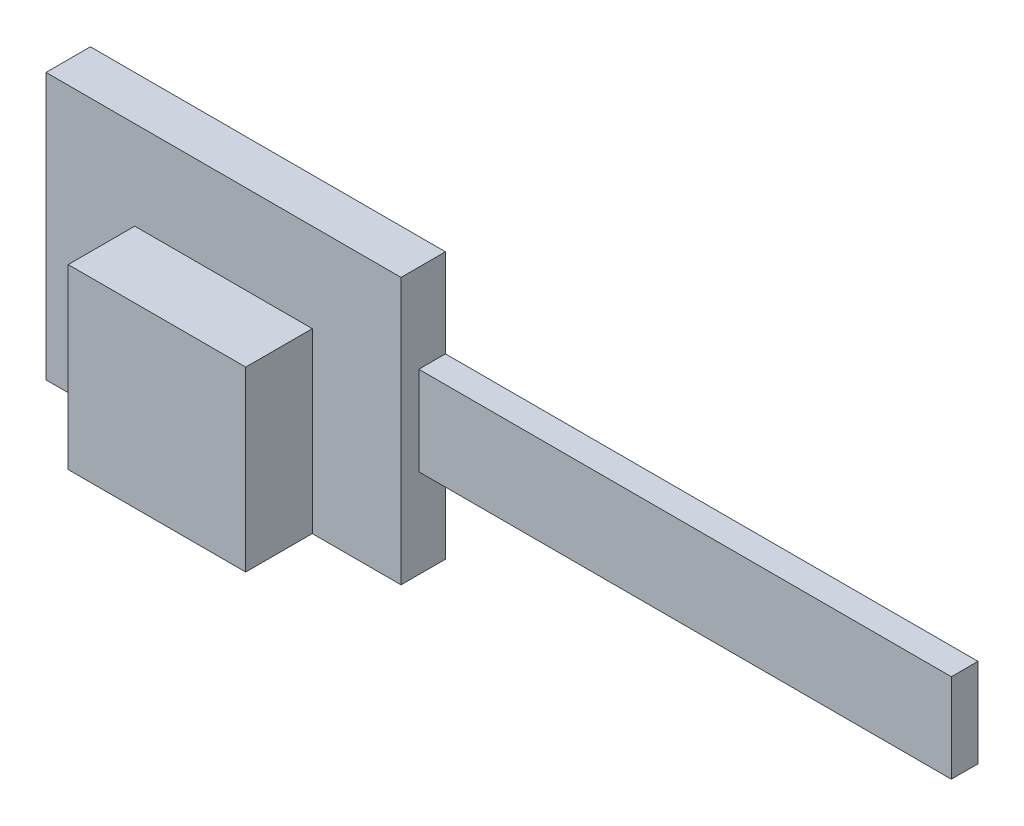
ISO-10303-21;
HEADER;
FILE_DESCRIPTION(('STEP AP214'),'2;1');
FILE_NAME('part.step','',(''),(''),'','','');
FILE_SCHEMA(('AUTOMOTIVE_DESIGN { 1 0 10303 214 1 1 1 1 }'));
ENDSEC;
DATA;
#1=APPLICATION_CONTEXT('core data for automotive mechanical design processes');
#2=APPLICATION_PROTOCOL_DEFINITION('international standard','automotive_design',2000,#1);
#3=PRODUCT_CONTEXT('',#1,'mechanical');
#4=PRODUCT('Part','Part','',(#3));
#5=PRODUCT_RELATED_PRODUCT_CATEGORY('part','',(#4));
#6=PRODUCT_DEFINITION_FORMATION('','',#4);
#7=PRODUCT_DEFINITION_CONTEXT('part definition',#1,'design');
#8=PRODUCT_DEFINITION('design','',#6,#7);
#9=PRODUCT_DEFINITION_SHAPE('','',#8);
#10=(LENGTH_UNIT() NAMED_UNIT(*) SI_UNIT(.MILLI.,.METRE.));
#11=(NAMED_UNIT(*) PLANE_ANGLE_UNIT() SI_UNIT($,.RADIAN.));
#12=(NAMED_UNIT(*) SI_UNIT($,.STERADIAN.) SOLID_ANGLE_UNIT());
#13=UNCERTAINTY_MEASURE_WITH_UNIT(LENGTH_MEASURE(1.E-05),#10,'distance_accuracy_value','');
#14=(GEOMETRIC_REPRESENTATION_CONTEXT(3) GLOBAL_UNCERTAINTY_ASSIGNED_CONTEXT((#13)) GLOBAL_UNIT_ASSIGNED_CONTEXT((#10,
#11,#12)) REPRESENTATION_CONTEXT('',''));
#15=CARTESIAN_POINT('',(0.,0.,0.));
#16=DIRECTION('',(0.,0.,1.));
#17=DIRECTION('',(1.,0.,0.));
#18=AXIS2_PLACEMENT_3D('',#15,#16,#17);
#19=CARTESIAN_POINT('',(4.,1.00757199680967,0.6));
#20=DIRECTION('',(-1.,0.,0.));
#21=DIRECTION('',(0.,0.,1.));
#22=AXIS2_PLACEMENT_3D('',#19,#20,#21);
#23=PLANE('',#22);
#24=DIRECTION('',(0.,1.,0.));
#25=VECTOR('',#24,1.);
#26=CARTESIAN_POINT('',(4.,1.00757199680967,0.));
#27=LINE('',#26,#25);
#28=CARTESIAN_POINT('',(4.,-0.992428003190327,0.));
#29=VERTEX_POINT('',#28);
#30=CARTESIAN_POINT('',(4.,1.00757199680967,0.));
#31=VERTEX_POINT('',#30);
#32=EDGE_CURVE('E111',#29,#31,#27,.T.);
#33=ORIENTED_EDGE('',*,*,#32,.F.);
#34=DIRECTION('',(0.,0.,-1.));
#35=VECTOR('',#34,1.);
#36=CARTESIAN_POINT('',(4.,-0.992428003190327,0.6));
#37=LINE('',#36,#35);
#38=CARTESIAN_POINT('',(4.,-0.992428003190327,0.6));
#39=VERTEX_POINT('',#38);
#40=EDGE_CURVE('E12',#39,#29,#37,.T.);
#41=ORIENTED_EDGE('',*,*,#40,.F.);
#42=DIRECTION('',(0.,1.,0.));
#43=VECTOR('',#42,1.);
#44=CARTESIAN_POINT('',(4.,1.00757199680967,0.6));
#45=LINE('',#44,#43);
#46=CARTESIAN_POINT('',(4.,1.00757199680967,0.6));
#47=VERTEX_POINT('',#46);
#48=EDGE_CURVE('E105',#39,#47,#45,.T.);
#49=ORIENTED_EDGE('',*,*,#48,.T.);
#50=DIRECTION('',(0.,0.,-1.));
#51=VECTOR('',#50,1.);
#52=CARTESIAN_POINT('',(4.,1.00757199680967,0.6));
#53=LINE('',#52,#51);
#54=EDGE_CURVE('E50',#47,#31,#53,.T.);
#55=ORIENTED_EDGE('',*,*,#54,.T.);
#56=EDGE_LOOP('',(#33,#41,#49,#55));
#57=FACE_BOUND('',#56,.T.);
#58=ADVANCED_FACE('F47',(#57),#23,.T.);
#59=CARTESIAN_POINT('',(4.,-0.992428003190327,0.6));
#60=DIRECTION('',(0.,-1.,0.));
#61=DIRECTION('',(1.,0.,0.));
#62=AXIS2_PLACEMENT_3D('',#59,#60,#61);
#63=PLANE('',#62);
#64=DIRECTION('',(-1.,0.,0.));
#65=VECTOR('',#64,1.);
#66=CARTESIAN_POINT('',(4.,-0.992428003190327,0.));
#67=LINE('',#66,#65);
#68=CARTESIAN_POINT('',(16.,-0.992428003190328,0.));
#69=VERTEX_POINT('',#68);
#70=EDGE_CURVE('E107',#69,#29,#67,.T.);
#71=ORIENTED_EDGE('',*,*,#70,.F.);
#72=DIRECTION('',(0.,0.,-1.));
#73=VECTOR('',#72,1.);
#74=CARTESIAN_POINT('',(16.,-0.992428003190328,0.6));
#75=LINE('',#74,#73);
#76=CARTESIAN_POINT('',(16.,-0.992428003190328,0.6));
#77=VERTEX_POINT('',#76);
#78=EDGE_CURVE('E56',#77,#69,#75,.T.);
#79=ORIENTED_EDGE('',*,*,#78,.F.);
#80=DIRECTION('',(-1.,0.,0.));
#81=VECTOR('',#80,1.);
#82=CARTESIAN_POINT('',(4.,-0.992428003190327,0.6));
#83=LINE('',#82,#81);
#84=EDGE_CURVE('E102',#77,#39,#83,.T.);
#85=ORIENTED_EDGE('',*,*,#84,.T.);
#86=ORIENTED_EDGE('',*,*,#40,.T.);
#87=EDGE_LOOP('',(#71,#79,#85,#86));
#88=FACE_BOUND('',#87,.T.);
#89=ADVANCED_FACE('F121',(#88),#63,.T.);
#90=CARTESIAN_POINT('',(16.,1.00757199680967,0.6));
#91=DIRECTION('',(1.,0.,0.));
#92=DIRECTION('',(0.,0.,-1.));
#93=AXIS2_PLACEMENT_3D('',#90,#91,#92);
#94=PLANE('',#93);
#95=DIRECTION('',(0.,-1.,0.));
#96=VECTOR('',#95,1.);
#97=CARTESIAN_POINT('',(16.,1.00757199680967,0.));
#98=LINE('',#97,#96);
#99=CARTESIAN_POINT('',(16.,1.00757199680967,0.));
#100=VERTEX_POINT('',#99);
#101=EDGE_CURVE('E97',#100,#69,#98,.T.);
#102=ORIENTED_EDGE('',*,*,#101,.F.);
#103=DIRECTION('',(0.,0.,-1.));
#104=VECTOR('',#103,1.);
#105=CARTESIAN_POINT('',(16.,1.00757199680967,0.6));
#106=LINE('',#105,#104);
#107=CARTESIAN_POINT('',(16.,1.00757199680967,0.6));
#108=VERTEX_POINT('',#107);
#109=EDGE_CURVE('E92',#108,#100,#106,.T.);
#110=ORIENTED_EDGE('',*,*,#109,.F.);
#111=DIRECTION('',(0.,-1.,0.));
#112=VECTOR('',#111,1.);
#113=CARTESIAN_POINT('',(16.,1.00757199680967,0.6));
#114=LINE('',#113,#112);
#115=EDGE_CURVE('E95',#108,#77,#114,.T.);
#116=ORIENTED_EDGE('',*,*,#115,.T.);
#117=ORIENTED_EDGE('',*,*,#78,.T.);
#118=EDGE_LOOP('',(#102,#110,#116,#117));
#119=FACE_BOUND('',#118,.T.);
#120=ADVANCED_FACE('F94',(#119),#94,.T.);
#121=CARTESIAN_POINT('',(4.,1.00757199680967,0.6));
#122=DIRECTION('',(0.,1.,0.));
#123=DIRECTION('',(-1.,0.,0.));
#124=AXIS2_PLACEMENT_3D('',#121,#122,#123);
#125=PLANE('',#124);
#126=DIRECTION('',(1.,0.,0.));
#127=VECTOR('',#126,1.);
#128=CARTESIAN_POINT('',(4.,1.00757199680967,0.));
#129=LINE('',#128,#127);
#130=EDGE_CURVE('E114',#31,#100,#129,.T.);
#131=ORIENTED_EDGE('',*,*,#130,.F.);
#132=ORIENTED_EDGE('',*,*,#54,.F.);
#133=DIRECTION('',(1.,0.,0.));
#134=VECTOR('',#133,1.);
#135=CARTESIAN_POINT('',(4.,1.00757199680967,0.6));
#136=LINE('',#135,#134);
#137=EDGE_CURVE('E101',#47,#108,#136,.T.);
#138=ORIENTED_EDGE('',*,*,#137,.T.);
#139=ORIENTED_EDGE('',*,*,#109,.T.);
#140=EDGE_LOOP('',(#131,#132,#138,#139));
#141=FACE_BOUND('',#140,.T.);
#142=ADVANCED_FACE('F104',(#141),#125,.T.);
#143=CARTESIAN_POINT('',(0.,0.,0.6));
#144=DIRECTION('',(0.,0.,1.));
#145=DIRECTION('',(1.,0.,0.));
#146=AXIS2_PLACEMENT_3D('',#143,#144,#145);
#147=PLANE('',#146);
#148=ORIENTED_EDGE('',*,*,#48,.F.);
#149=ORIENTED_EDGE('',*,*,#84,.F.);
#150=ORIENTED_EDGE('',*,*,#115,.F.);
#151=ORIENTED_EDGE('',*,*,#137,.F.);
#152=EDGE_LOOP('',(#148,#149,#150,#151));
#153=FACE_BOUND('',#152,.T.);
#154=ADVANCED_FACE('F100',(#153),#147,.T.);
#155=CARTESIAN_POINT('',(0.,0.,0.));
#156=DIRECTION('',(0.,0.,1.));
#157=DIRECTION('',(1.,0.,0.));
#158=AXIS2_PLACEMENT_3D('',#155,#156,#157);
#159=PLANE('',#158);
#160=ORIENTED_EDGE('',*,*,#32,.T.);
#161=ORIENTED_EDGE('',*,*,#130,.T.);
#162=ORIENTED_EDGE('',*,*,#101,.T.);
#163=ORIENTED_EDGE('',*,*,#70,.T.);
#164=EDGE_LOOP('',(#160,#161,#162,#163));
#165=FACE_BOUND('',#164,.T.);
#166=ADVANCED_FACE('F120',(#165),#159,.F.);
#167=CLOSED_SHELL('',(#58,#89,#120,#142,#154,#166));
#168=MANIFOLD_SOLID_BREP('B2',#167);
#169=CARTESIAN_POINT('',(-4.,3.,1.));
#170=DIRECTION('',(1.,0.,0.));
#171=DIRECTION('',(0.,0.,-1.));
#172=AXIS2_PLACEMENT_3D('',#169,#170,#171);
#173=PLANE('',#172);
#174=DIRECTION('',(0.,-1.,0.));
#175=VECTOR('',#174,1.);
#176=CARTESIAN_POINT('',(-4.,3.,0.));
#177=LINE('',#176,#175);
#178=CARTESIAN_POINT('',(-4.,3.,0.));
#179=VERTEX_POINT('',#178);
#180=CARTESIAN_POINT('',(-4.,-3.,0.));
#181=VERTEX_POINT('',#180);
#182=EDGE_CURVE('E255',#179,#181,#177,.T.);
#183=ORIENTED_EDGE('',*,*,#182,.T.);
#184=DIRECTION('',(0.,0.,-1.));
#185=VECTOR('',#184,1.);
#186=CARTESIAN_POINT('',(-4.,-3.,1.));
#187=LINE('',#186,#185);
#188=CARTESIAN_POINT('',(-4.,-3.,1.));
#189=VERTEX_POINT('',#188);
#190=EDGE_CURVE('E45',#189,#181,#187,.T.);
#191=ORIENTED_EDGE('',*,*,#190,.F.);
#192=DIRECTION('',(0.,-1.,0.));
#193=VECTOR('',#192,1.);
#194=CARTESIAN_POINT('',(-4.,3.,1.));
#195=LINE('',#194,#193);
#196=CARTESIAN_POINT('',(-4.,3.,1.));
#197=VERTEX_POINT('',#196);
#198=EDGE_CURVE('E264',#197,#189,#195,.T.);
#199=ORIENTED_EDGE('',*,*,#198,.F.);
#200=DIRECTION('',(0.,0.,-1.));
#201=VECTOR('',#200,1.);
#202=CARTESIAN_POINT('',(-4.,3.,1.));
#203=LINE('',#202,#201);
#204=EDGE_CURVE('E274',#197,#179,#203,.T.);
#205=ORIENTED_EDGE('',*,*,#204,.T.);
#206=EDGE_LOOP('',(#183,#191,#199,#205));
#207=FACE_BOUND('',#206,.T.);
#208=ADVANCED_FACE('F170',(#207),#173,.F.);
#209=CARTESIAN_POINT('',(-4.,-3.,1.));
#210=DIRECTION('',(0.,1.,0.));
#211=DIRECTION('',(-1.,0.,0.));
#212=AXIS2_PLACEMENT_3D('',#209,#210,#211);
#213=PLANE('',#212);
#214=DIRECTION('',(1.,0.,0.));
#215=VECTOR('',#214,1.);
#216=CARTESIAN_POINT('',(-4.,-3.,0.));
#217=LINE('',#216,#215);
#218=CARTESIAN_POINT('',(4.,-3.,0.));
#219=VERTEX_POINT('',#218);
#220=EDGE_CURVE('E258',#181,#219,#217,.T.);
#221=ORIENTED_EDGE('',*,*,#220,.T.);
#222=DIRECTION('',(0.,0.,-1.));
#223=VECTOR('',#222,1.);
#224=CARTESIAN_POINT('',(4.,-3.,1.));
#225=LINE('',#224,#223);
#226=CARTESIAN_POINT('',(4.,-3.,1.));
#227=VERTEX_POINT('',#226);
#228=EDGE_CURVE('E177',#227,#219,#225,.T.);
#229=ORIENTED_EDGE('',*,*,#228,.F.);
#230=DIRECTION('',(1.,0.,0.));
#231=VECTOR('',#230,1.);
#232=CARTESIAN_POINT('',(-4.,-3.,1.));
#233=LINE('',#232,#231);
#234=CARTESIAN_POINT('',(2.,-3.,1.));
#235=VERTEX_POINT('',#234);
#236=EDGE_CURVE('E267',#235,#227,#233,.T.);
#237=ORIENTED_EDGE('',*,*,#236,.F.);
#238=DIRECTION('',(0.,0.,-1.));
#239=VECTOR('',#238,1.);
#240=CARTESIAN_POINT('',(2.,-3.,2.5));
#241=LINE('',#240,#239);
#242=CARTESIAN_POINT('',(2.,-3.,2.5));
#243=VERTEX_POINT('',#242);
#244=EDGE_CURVE('E239',#243,#235,#241,.T.);
#245=ORIENTED_EDGE('',*,*,#244,.F.);
#246=DIRECTION('',(1.,0.,0.));
#247=VECTOR('',#246,1.);
#248=CARTESIAN_POINT('',(-2.,-3.,2.5));
#249=LINE('',#248,#247);
#250=CARTESIAN_POINT('',(-2.,-3.,2.5));
#251=VERTEX_POINT('',#250);
#252=EDGE_CURVE('E233',#251,#243,#249,.T.);
#253=ORIENTED_EDGE('',*,*,#252,.F.);
#254=DIRECTION('',(0.,0.,-1.));
#255=VECTOR('',#254,1.);
#256=CARTESIAN_POINT('',(-2.,-3.,2.5));
#257=LINE('',#256,#255);
#258=CARTESIAN_POINT('',(-2.,-3.,1.));
#259=VERTEX_POINT('',#258);
#260=EDGE_CURVE('E237',#251,#259,#257,.T.);
#261=ORIENTED_EDGE('',*,*,#260,.T.);
#262=EDGE_CURVE('E269',#189,#259,#233,.T.);
#263=ORIENTED_EDGE('',*,*,#262,.F.);
#264=ORIENTED_EDGE('',*,*,#190,.T.);
#265=EDGE_LOOP('',(#221,#229,#237,#245,#253,#261,#263,#264));
#266=FACE_BOUND('',#265,.T.);
#267=ADVANCED_FACE('F235',(#266),#213,.F.);
#268=CARTESIAN_POINT('',(4.,3.,1.));
#269=DIRECTION('',(-1.,0.,0.));
#270=DIRECTION('',(0.,0.,1.));
#271=AXIS2_PLACEMENT_3D('',#268,#269,#270);
#272=PLANE('',#271);
#273=DIRECTION('',(0.,1.,0.));
#274=VECTOR('',#273,1.);
#275=CARTESIAN_POINT('',(4.,3.,0.));
#276=LINE('',#275,#274);
#277=CARTESIAN_POINT('',(4.,3.,0.));
#278=VERTEX_POINT('',#277);
#279=EDGE_CURVE('E277',#219,#278,#276,.T.);
#280=ORIENTED_EDGE('',*,*,#279,.T.);
#281=DIRECTION('',(0.,0.,-1.));
#282=VECTOR('',#281,1.);
#283=CARTESIAN_POINT('',(4.,3.,1.));
#284=LINE('',#283,#282);
#285=CARTESIAN_POINT('',(4.,3.,1.));
#286=VERTEX_POINT('',#285);
#287=EDGE_CURVE('E282',#286,#278,#284,.T.);
#288=ORIENTED_EDGE('',*,*,#287,.F.);
#289=DIRECTION('',(0.,1.,0.));
#290=VECTOR('',#289,1.);
#291=CARTESIAN_POINT('',(4.,3.,1.));
#292=LINE('',#291,#290);
#293=EDGE_CURVE('E271',#227,#286,#292,.T.);
#294=ORIENTED_EDGE('',*,*,#293,.F.);
#295=ORIENTED_EDGE('',*,*,#228,.T.);
#296=EDGE_LOOP('',(#280,#288,#294,#295));
#297=FACE_BOUND('',#296,.T.);
#298=ADVANCED_FACE('F289',(#297),#272,.F.);
#299=CARTESIAN_POINT('',(-4.,3.,1.));
#300=DIRECTION('',(0.,-1.,0.));
#301=DIRECTION('',(1.,0.,0.));
#302=AXIS2_PLACEMENT_3D('',#299,#300,#301);
#303=PLANE('',#302);
#304=DIRECTION('',(-1.,0.,0.));
#305=VECTOR('',#304,1.);
#306=CARTESIAN_POINT('',(-4.,3.,0.));
#307=LINE('',#306,#305);
#308=EDGE_CURVE('E268',#278,#179,#307,.T.);
#309=ORIENTED_EDGE('',*,*,#308,.T.);
#310=ORIENTED_EDGE('',*,*,#204,.F.);
#311=DIRECTION('',(-1.,0.,0.));
#312=VECTOR('',#311,1.);
#313=CARTESIAN_POINT('',(-4.,3.,1.));
#314=LINE('',#313,#312);
#315=EDGE_CURVE('E273',#286,#197,#314,.T.);
#316=ORIENTED_EDGE('',*,*,#315,.F.);
#317=ORIENTED_EDGE('',*,*,#287,.T.);
#318=EDGE_LOOP('',(#309,#310,#316,#317));
#319=FACE_BOUND('',#318,.T.);
#320=ADVANCED_FACE('F297',(#319),#303,.F.);
#321=CARTESIAN_POINT('',(0.,0.,1.));
#322=DIRECTION('',(0.,0.,1.));
#323=DIRECTION('',(1.,0.,0.));
#324=AXIS2_PLACEMENT_3D('',#321,#322,#323);
#325=PLANE('',#324);
#326=DIRECTION('',(0.,-1.,0.));
#327=VECTOR('',#326,1.);
#328=CARTESIAN_POINT('',(-2.,1.,1.));
#329=LINE('',#328,#327);
#330=CARTESIAN_POINT('',(-2.,1.,1.));
#331=VERTEX_POINT('',#330);
#332=EDGE_CURVE('E184',#331,#259,#329,.T.);
#333=ORIENTED_EDGE('',*,*,#332,.F.);
#334=DIRECTION('',(-1.,0.,0.));
#335=VECTOR('',#334,1.);
#336=CARTESIAN_POINT('',(-2.,1.,1.));
#337=LINE('',#336,#335);
#338=CARTESIAN_POINT('',(2.,0.999999999999999,1.));
#339=VERTEX_POINT('',#338);
#340=EDGE_CURVE('E252',#339,#331,#337,.T.);
#341=ORIENTED_EDGE('',*,*,#340,.F.);
#342=DIRECTION('',(0.,1.,0.));
#343=VECTOR('',#342,1.);
#344=CARTESIAN_POINT('',(2.,0.999999999999999,1.));
#345=LINE('',#344,#343);
#346=EDGE_CURVE('E190',#235,#339,#345,.T.);
#347=ORIENTED_EDGE('',*,*,#346,.F.);
#348=ORIENTED_EDGE('',*,*,#236,.T.);
#349=ORIENTED_EDGE('',*,*,#293,.T.);
#350=ORIENTED_EDGE('',*,*,#315,.T.);
#351=ORIENTED_EDGE('',*,*,#198,.T.);
#352=ORIENTED_EDGE('',*,*,#262,.T.);
#353=EDGE_LOOP('',(#333,#341,#347,#348,#349,#350,#351,#352));
#354=FACE_BOUND('',#353,.T.);
#355=ADVANCED_FACE('F302',(#354),#325,.T.);
#356=CARTESIAN_POINT('',(0.,0.,0.));
#357=DIRECTION('',(0.,0.,1.));
#358=DIRECTION('',(1.,0.,0.));
#359=AXIS2_PLACEMENT_3D('',#356,#357,#358);
#360=PLANE('',#359);
#361=ORIENTED_EDGE('',*,*,#182,.F.);
#362=ORIENTED_EDGE('',*,*,#308,.F.);
#363=ORIENTED_EDGE('',*,*,#279,.F.);
#364=ORIENTED_EDGE('',*,*,#220,.F.);
#365=EDGE_LOOP('',(#361,#362,#363,#364));
#366=FACE_BOUND('',#365,.T.);
#367=ADVANCED_FACE('F294',(#366),#360,.F.);
#368=CARTESIAN_POINT('',(-2.,1.,2.5));
#369=DIRECTION('',(1.,0.,0.));
#370=DIRECTION('',(0.,1.,0.));
#371=AXIS2_PLACEMENT_3D('',#368,#369,#370);
#372=PLANE('',#371);
#373=ORIENTED_EDGE('',*,*,#332,.T.);
#374=ORIENTED_EDGE('',*,*,#260,.F.);
#375=DIRECTION('',(0.,-1.,0.));
#376=VECTOR('',#375,1.);
#377=CARTESIAN_POINT('',(-2.,1.,2.5));
#378=LINE('',#377,#376);
#379=CARTESIAN_POINT('',(-2.,1.,2.5));
#380=VERTEX_POINT('',#379);
#381=EDGE_CURVE('E243',#380,#251,#378,.T.);
#382=ORIENTED_EDGE('',*,*,#381,.F.);
#383=DIRECTION('',(0.,0.,-1.));
#384=VECTOR('',#383,1.);
#385=CARTESIAN_POINT('',(-2.,1.,2.5));
#386=LINE('',#385,#384);
#387=EDGE_CURVE('E308',#380,#331,#386,.T.);
#388=ORIENTED_EDGE('',*,*,#387,.T.);
#389=EDGE_LOOP('',(#373,#374,#382,#388));
#390=FACE_BOUND('',#389,.T.);
#391=ADVANCED_FACE('F254',(#390),#372,.F.);
#392=CARTESIAN_POINT('',(2.,0.999999999999999,2.5));
#393=DIRECTION('',(-1.,0.,0.));
#394=DIRECTION('',(0.,-1.,0.));
#395=AXIS2_PLACEMENT_3D('',#392,#393,#394);
#396=PLANE('',#395);
#397=ORIENTED_EDGE('',*,*,#346,.T.);
#398=DIRECTION('',(0.,0.,-1.));
#399=VECTOR('',#398,1.);
#400=CARTESIAN_POINT('',(2.,0.999999999999999,2.5));
#401=LINE('',#400,#399);
#402=CARTESIAN_POINT('',(2.,0.999999999999999,2.5));
#403=VERTEX_POINT('',#402);
#404=EDGE_CURVE('E260',#403,#339,#401,.T.);
#405=ORIENTED_EDGE('',*,*,#404,.F.);
#406=DIRECTION('',(0.,1.,0.));
#407=VECTOR('',#406,1.);
#408=CARTESIAN_POINT('',(2.,0.999999999999999,2.5));
#409=LINE('',#408,#407);
#410=EDGE_CURVE('E242',#243,#403,#409,.T.);
#411=ORIENTED_EDGE('',*,*,#410,.F.);
#412=ORIENTED_EDGE('',*,*,#244,.T.);
#413=EDGE_LOOP('',(#397,#405,#411,#412));
#414=FACE_BOUND('',#413,.T.);
#415=ADVANCED_FACE('F304',(#414),#396,.F.);
#416=CARTESIAN_POINT('',(-2.,1.,2.5));
#417=DIRECTION('',(0.,-1.,0.));
#418=DIRECTION('',(1.,0.,0.));
#419=AXIS2_PLACEMENT_3D('',#416,#417,#418);
#420=PLANE('',#419);
#421=ORIENTED_EDGE('',*,*,#340,.T.);
#422=ORIENTED_EDGE('',*,*,#387,.F.);
#423=DIRECTION('',(-1.,0.,0.));
#424=VECTOR('',#423,1.);
#425=CARTESIAN_POINT('',(-2.,1.,2.5));
#426=LINE('',#425,#424);
#427=EDGE_CURVE('E248',#403,#380,#426,.T.);
#428=ORIENTED_EDGE('',*,*,#427,.F.);
#429=ORIENTED_EDGE('',*,*,#404,.T.);
#430=EDGE_LOOP('',(#421,#422,#428,#429));
#431=FACE_BOUND('',#430,.T.);
#432=ADVANCED_FACE('F315',(#431),#420,.F.);
#433=CARTESIAN_POINT('',(0.,0.,2.5));
#434=DIRECTION('',(0.,0.,1.));
#435=DIRECTION('',(1.,0.,0.));
#436=AXIS2_PLACEMENT_3D('',#433,#434,#435);
#437=PLANE('',#436);
#438=ORIENTED_EDGE('',*,*,#381,.T.);
#439=ORIENTED_EDGE('',*,*,#252,.T.);
#440=ORIENTED_EDGE('',*,*,#410,.T.);
#441=ORIENTED_EDGE('',*,*,#427,.T.);
#442=EDGE_LOOP('',(#438,#439,#440,#441));
#443=FACE_BOUND('',#442,.T.);
#444=ADVANCED_FACE('F246',(#443),#437,.T.);
#445=CLOSED_SHELL('',(#208,#267,#298,#320,#355,#367,#391,#415,#432,#444));
#446=MANIFOLD_SOLID_BREP('B6',#445);
#447=ADVANCED_BREP_SHAPE_REPRESENTATION('',(#18,#168,#446),#14);
#448=SHAPE_DEFINITION_REPRESENTATION(#9,#447);
ENDSEC;
END-ISO-10303-21;
